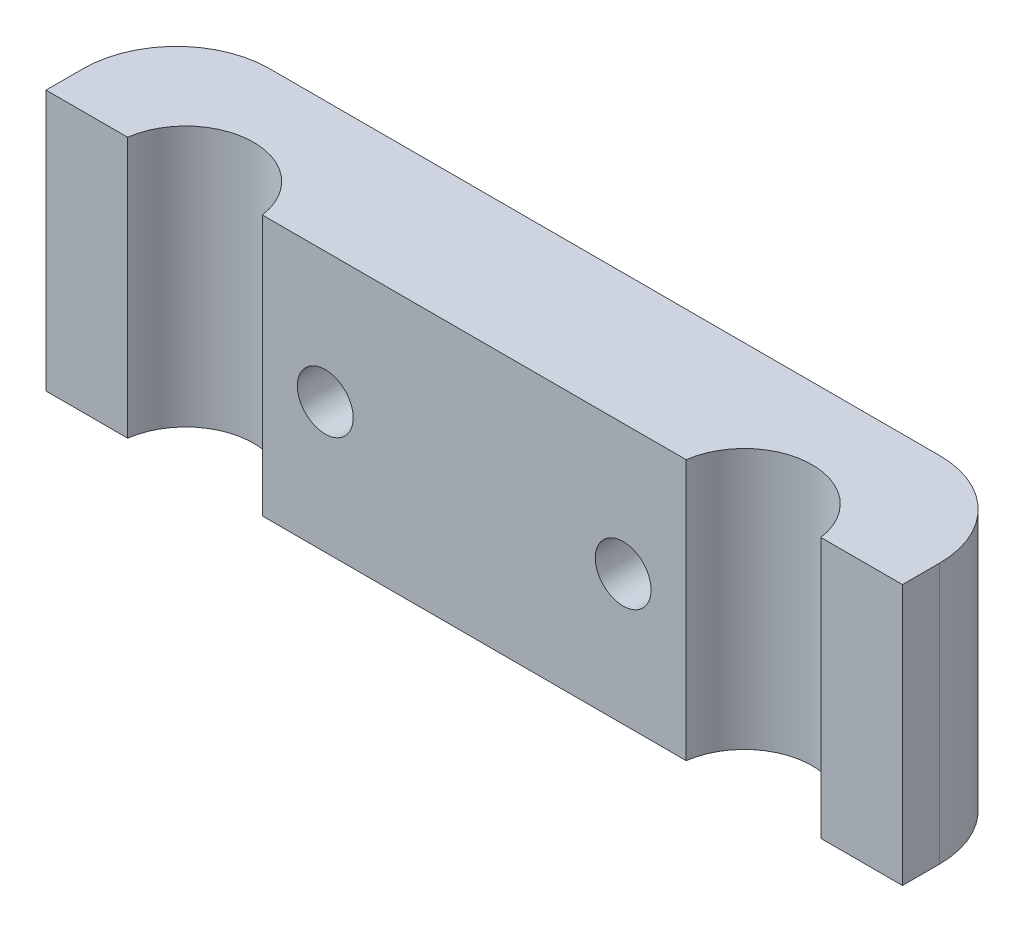
ISO-10303-21;
HEADER;
FILE_DESCRIPTION(('STEP AP214'),'2;1');
FILE_NAME('part.step','',(''),(''),'','','');
FILE_SCHEMA(('AUTOMOTIVE_DESIGN { 1 0 10303 214 1 1 1 1 }'));
ENDSEC;
DATA;
#1=APPLICATION_CONTEXT('core data for automotive mechanical design processes');
#2=APPLICATION_PROTOCOL_DEFINITION('international standard','automotive_design',2000,#1);
#3=PRODUCT_CONTEXT('',#1,'mechanical');
#4=PRODUCT('Part','Part','',(#3));
#5=PRODUCT_RELATED_PRODUCT_CATEGORY('part','',(#4));
#6=PRODUCT_DEFINITION_FORMATION('','',#4);
#7=PRODUCT_DEFINITION_CONTEXT('part definition',#1,'design');
#8=PRODUCT_DEFINITION('design','',#6,#7);
#9=PRODUCT_DEFINITION_SHAPE('','',#8);
#10=(LENGTH_UNIT() NAMED_UNIT(*) SI_UNIT(.MILLI.,.METRE.));
#11=(NAMED_UNIT(*) PLANE_ANGLE_UNIT() SI_UNIT($,.RADIAN.));
#12=(NAMED_UNIT(*) SI_UNIT($,.STERADIAN.) SOLID_ANGLE_UNIT());
#13=UNCERTAINTY_MEASURE_WITH_UNIT(LENGTH_MEASURE(1.E-05),#10,'distance_accuracy_value','');
#14=(GEOMETRIC_REPRESENTATION_CONTEXT(3) GLOBAL_UNCERTAINTY_ASSIGNED_CONTEXT((#13)) GLOBAL_UNIT_ASSIGNED_CONTEXT((#10,
#11,#12)) REPRESENTATION_CONTEXT('',''));
#15=CARTESIAN_POINT('',(0.,0.,0.));
#16=DIRECTION('',(0.,0.,1.));
#17=DIRECTION('',(1.,0.,0.));
#18=AXIS2_PLACEMENT_3D('',#15,#16,#17);
#19=CARTESIAN_POINT('',(8.,0.,-0.00100000000000013));
#20=DIRECTION('',(0.,0.,1.));
#21=DIRECTION('',(1.,0.,0.));
#22=AXIS2_PLACEMENT_3D('',#19,#20,#21);
#23=CYLINDRICAL_SURFACE('',#22,1.5);
#24=CARTESIAN_POINT('',(8.,0.,7.));
#25=DIRECTION('',(0.,0.,1.));
#26=DIRECTION('',(-1.,0.,0.));
#27=AXIS2_PLACEMENT_3D('',#24,#25,#26);
#28=CIRCLE('',#27,1.5);
#29=CARTESIAN_POINT('',(6.5,0.,7.));
#30=VERTEX_POINT('',#29);
#31=EDGE_CURVE('E220',#30,#30,#28,.T.);
#32=ORIENTED_EDGE('',*,*,#31,.T.);
#33=EDGE_LOOP('',(#32));
#34=FACE_BOUND('',#33,.T.);
#35=CARTESIAN_POINT('',(8.,0.,3.8));
#36=DIRECTION('',(0.,0.,-1.));
#37=DIRECTION('',(-1.,0.,0.));
#38=AXIS2_PLACEMENT_3D('',#35,#36,#37);
#39=CIRCLE('',#38,1.5);
#40=CARTESIAN_POINT('',(6.5,0.,3.8));
#41=VERTEX_POINT('',#40);
#42=EDGE_CURVE('E172',#41,#41,#39,.F.);
#43=ORIENTED_EDGE('',*,*,#42,.F.);
#44=EDGE_LOOP('',(#43));
#45=FACE_BOUND('',#44,.T.);
#46=ADVANCED_FACE('F33',(#34,#45),#23,.F.);
#47=CARTESIAN_POINT('',(-8.,0.,-0.00100000000000013));
#48=DIRECTION('',(0.,0.,1.));
#49=DIRECTION('',(1.,0.,0.));
#50=AXIS2_PLACEMENT_3D('',#47,#48,#49);
#51=CYLINDRICAL_SURFACE('',#50,1.5);
#52=CARTESIAN_POINT('',(-8.,0.,7.));
#53=DIRECTION('',(0.,0.,1.));
#54=DIRECTION('',(1.,0.,0.));
#55=AXIS2_PLACEMENT_3D('',#52,#53,#54);
#56=CIRCLE('',#55,1.5);
#57=CARTESIAN_POINT('',(-6.5,0.,7.));
#58=VERTEX_POINT('',#57);
#59=EDGE_CURVE('E156',#58,#58,#56,.T.);
#60=ORIENTED_EDGE('',*,*,#59,.T.);
#61=EDGE_LOOP('',(#60));
#62=FACE_BOUND('',#61,.T.);
#63=CARTESIAN_POINT('',(-8.,0.,3.8));
#64=DIRECTION('',(0.,0.,-1.));
#65=DIRECTION('',(-1.,0.,0.));
#66=AXIS2_PLACEMENT_3D('',#63,#64,#65);
#67=CIRCLE('',#66,1.5);
#68=CARTESIAN_POINT('',(-9.5,0.,3.8));
#69=VERTEX_POINT('',#68);
#70=EDGE_CURVE('E169',#69,#69,#67,.F.);
#71=ORIENTED_EDGE('',*,*,#70,.F.);
#72=EDGE_LOOP('',(#71));
#73=FACE_BOUND('',#72,.T.);
#74=ADVANCED_FACE('F236',(#62,#73),#51,.F.);
#75=CARTESIAN_POINT('',(0.,0.,7.));
#76=DIRECTION('',(0.,0.,-1.));
#77=DIRECTION('',(-1.,0.,0.));
#78=AXIS2_PLACEMENT_3D('',#75,#76,#77);
#79=PLANE('',#78);
#80=DIRECTION('',(1.,0.,0.));
#81=VECTOR('',#80,1.);
#82=CARTESIAN_POINT('',(-23.,-7.,7.));
#83=LINE('',#82,#81);
#84=CARTESIAN_POINT('',(-23.,-7.,7.));
#85=VERTEX_POINT('',#84);
#86=CARTESIAN_POINT('',(-18.6155912379582,-7.,7.));
#87=VERTEX_POINT('',#86);
#88=EDGE_CURVE('E130',#85,#87,#83,.T.);
#89=ORIENTED_EDGE('',*,*,#88,.T.);
#90=DIRECTION('',(0.,1.,0.));
#91=VECTOR('',#90,1.);
#92=CARTESIAN_POINT('',(-18.6155912379582,-7.001,7.));
#93=LINE('',#92,#91);
#94=CARTESIAN_POINT('',(-18.6155912379582,7.,7.));
#95=VERTEX_POINT('',#94);
#96=EDGE_CURVE('E114',#95,#87,#93,.F.);
#97=ORIENTED_EDGE('',*,*,#96,.F.);
#98=DIRECTION('',(-1.,0.,0.));
#99=VECTOR('',#98,1.);
#100=CARTESIAN_POINT('',(-23.,7.,7.));
#101=LINE('',#100,#99);
#102=CARTESIAN_POINT('',(-23.,7.,7.));
#103=VERTEX_POINT('',#102);
#104=EDGE_CURVE('E127',#95,#103,#101,.T.);
#105=ORIENTED_EDGE('',*,*,#104,.T.);
#106=DIRECTION('',(0.,-1.,0.));
#107=VECTOR('',#106,1.);
#108=CARTESIAN_POINT('',(-23.,-7.,7.));
#109=LINE('',#108,#107);
#110=EDGE_CURVE('E145',#103,#85,#109,.T.);
#111=ORIENTED_EDGE('',*,*,#110,.T.);
#112=EDGE_LOOP('',(#89,#97,#105,#111));
#113=FACE_BOUND('',#112,.T.);
#114=ADVANCED_FACE('F126',(#113),#79,.F.);
#115=ORIENTED_EDGE('',*,*,#31,.F.);
#116=EDGE_LOOP('',(#115));
#117=FACE_BOUND('',#116,.T.);
#118=ORIENTED_EDGE('',*,*,#59,.F.);
#119=EDGE_LOOP('',(#118));
#120=FACE_BOUND('',#119,.T.);
#121=CARTESIAN_POINT('',(11.3844087620418,7.,7.));
#122=VERTEX_POINT('',#121);
#123=CARTESIAN_POINT('',(-11.3844087620418,7.,7.));
#124=VERTEX_POINT('',#123);
#125=EDGE_CURVE('E136',#122,#124,#101,.T.);
#126=ORIENTED_EDGE('',*,*,#125,.T.);
#127=DIRECTION('',(0.,1.,0.));
#128=VECTOR('',#127,1.);
#129=CARTESIAN_POINT('',(-11.3844087620418,-7.001,7.));
#130=LINE('',#129,#128);
#131=CARTESIAN_POINT('',(-11.3844087620418,-7.,7.));
#132=VERTEX_POINT('',#131);
#133=EDGE_CURVE('E117',#132,#124,#130,.T.);
#134=ORIENTED_EDGE('',*,*,#133,.F.);
#135=CARTESIAN_POINT('',(11.3844087620418,-7.,7.));
#136=VERTEX_POINT('',#135);
#137=EDGE_CURVE('E150',#132,#136,#83,.T.);
#138=ORIENTED_EDGE('',*,*,#137,.T.);
#139=DIRECTION('',(0.,1.,0.));
#140=VECTOR('',#139,1.);
#141=CARTESIAN_POINT('',(11.3844087620418,-7.001,7.));
#142=LINE('',#141,#140);
#143=EDGE_CURVE('E213',#122,#136,#142,.F.);
#144=ORIENTED_EDGE('',*,*,#143,.F.);
#145=EDGE_LOOP('',(#126,#134,#138,#144));
#146=FACE_BOUND('',#145,.T.);
#147=ADVANCED_FACE('F212',(#117,#120,#146),#79,.F.);
#148=CARTESIAN_POINT('',(23.,-7.,7.));
#149=DIRECTION('',(-1.,0.,0.));
#150=DIRECTION('',(0.,0.,1.));
#151=AXIS2_PLACEMENT_3D('',#148,#149,#150);
#152=PLANE('',#151);
#153=DIRECTION('',(0.,0.,-1.));
#154=VECTOR('',#153,1.);
#155=CARTESIAN_POINT('',(23.,-7.,7.));
#156=LINE('',#155,#154);
#157=CARTESIAN_POINT('',(23.,-7.,7.));
#158=VERTEX_POINT('',#157);
#159=CARTESIAN_POINT('',(23.,-7.,5.));
#160=VERTEX_POINT('',#159);
#161=EDGE_CURVE('E153',#158,#160,#156,.T.);
#162=ORIENTED_EDGE('',*,*,#161,.T.);
#163=DIRECTION('',(0.,1.,0.));
#164=VECTOR('',#163,1.);
#165=CARTESIAN_POINT('',(23.,7.,5.));
#166=LINE('',#165,#164);
#167=CARTESIAN_POINT('',(23.,7.,5.));
#168=VERTEX_POINT('',#167);
#169=EDGE_CURVE('E11',#160,#168,#166,.T.);
#170=ORIENTED_EDGE('',*,*,#169,.T.);
#171=DIRECTION('',(0.,0.,-1.));
#172=VECTOR('',#171,1.);
#173=CARTESIAN_POINT('',(23.,7.,7.));
#174=LINE('',#173,#172);
#175=CARTESIAN_POINT('',(23.,7.,7.));
#176=VERTEX_POINT('',#175);
#177=EDGE_CURVE('E165',#176,#168,#174,.T.);
#178=ORIENTED_EDGE('',*,*,#177,.F.);
#179=DIRECTION('',(0.,1.,0.));
#180=VECTOR('',#179,1.);
#181=CARTESIAN_POINT('',(23.,-7.,7.));
#182=LINE('',#181,#180);
#183=EDGE_CURVE('E137',#158,#176,#182,.T.);
#184=ORIENTED_EDGE('',*,*,#183,.F.);
#185=EDGE_LOOP('',(#162,#170,#178,#184));
#186=FACE_BOUND('',#185,.T.);
#187=ADVANCED_FACE('F200',(#186),#152,.F.);
#188=CARTESIAN_POINT('',(-23.,7.,7.));
#189=DIRECTION('',(0.,-1.,0.));
#190=DIRECTION('',(0.,0.,-1.));
#191=AXIS2_PLACEMENT_3D('',#188,#189,#190);
#192=PLANE('',#191);
#193=DIRECTION('',(-1.,0.,0.));
#194=VECTOR('',#193,1.);
#195=CARTESIAN_POINT('',(-23.,7.,0.));
#196=LINE('',#195,#194);
#197=CARTESIAN_POINT('',(18.,7.,0.));
#198=VERTEX_POINT('',#197);
#199=CARTESIAN_POINT('',(-18.,7.,0.));
#200=VERTEX_POINT('',#199);
#201=EDGE_CURVE('E154',#198,#200,#196,.T.);
#202=ORIENTED_EDGE('',*,*,#201,.T.);
#203=CARTESIAN_POINT('',(-18.,7.,5.));
#204=DIRECTION('',(0.,-1.,0.));
#205=DIRECTION('',(0.,0.,-1.));
#206=AXIS2_PLACEMENT_3D('',#203,#204,#205);
#207=CIRCLE('',#206,5.);
#208=CARTESIAN_POINT('',(-23.,7.,5.));
#209=VERTEX_POINT('',#208);
#210=EDGE_CURVE('E41',#200,#209,#207,.F.);
#211=ORIENTED_EDGE('',*,*,#210,.T.);
#212=DIRECTION('',(0.,0.,-1.));
#213=VECTOR('',#212,1.);
#214=CARTESIAN_POINT('',(-23.,7.,7.));
#215=LINE('',#214,#213);
#216=EDGE_CURVE('E134',#103,#209,#215,.T.);
#217=ORIENTED_EDGE('',*,*,#216,.F.);
#218=ORIENTED_EDGE('',*,*,#104,.F.);
#219=CARTESIAN_POINT('',(-15.,7.,7.5));
#220=DIRECTION('',(0.,1.,0.));
#221=DIRECTION('',(0.,0.,1.));
#222=AXIS2_PLACEMENT_3D('',#219,#220,#221);
#223=CIRCLE('',#222,3.65);
#224=EDGE_CURVE('E111',#124,#95,#223,.T.);
#225=ORIENTED_EDGE('',*,*,#224,.F.);
#226=ORIENTED_EDGE('',*,*,#125,.F.);
#227=CARTESIAN_POINT('',(15.,7.,7.5));
#228=DIRECTION('',(0.,1.,0.));
#229=DIRECTION('',(0.,0.,-1.));
#230=AXIS2_PLACEMENT_3D('',#227,#228,#229);
#231=CIRCLE('',#230,3.65);
#232=CARTESIAN_POINT('',(18.6155912379582,7.,7.));
#233=VERTEX_POINT('',#232);
#234=EDGE_CURVE('E208',#233,#122,#231,.T.);
#235=ORIENTED_EDGE('',*,*,#234,.F.);
#236=EDGE_CURVE('E139',#176,#233,#101,.T.);
#237=ORIENTED_EDGE('',*,*,#236,.F.);
#238=ORIENTED_EDGE('',*,*,#177,.T.);
#239=CARTESIAN_POINT('',(18.,7.,5.));
#240=DIRECTION('',(0.,-1.,0.));
#241=DIRECTION('',(0.,0.,-1.));
#242=AXIS2_PLACEMENT_3D('',#239,#240,#241);
#243=CIRCLE('',#242,5.);
#244=EDGE_CURVE('E48',#168,#198,#243,.F.);
#245=ORIENTED_EDGE('',*,*,#244,.T.);
#246=EDGE_LOOP('',(#202,#211,#217,#218,#225,#226,#235,#237,#238,#245));
#247=FACE_BOUND('',#246,.T.);
#248=ADVANCED_FACE('F132',(#247),#192,.F.);
#249=CARTESIAN_POINT('',(-23.,-7.,7.));
#250=DIRECTION('',(1.,0.,0.));
#251=DIRECTION('',(0.,0.,-1.));
#252=AXIS2_PLACEMENT_3D('',#249,#250,#251);
#253=PLANE('',#252);
#254=ORIENTED_EDGE('',*,*,#216,.T.);
#255=DIRECTION('',(0.,-1.,0.));
#256=VECTOR('',#255,1.);
#257=CARTESIAN_POINT('',(-23.,-7.,5.));
#258=LINE('',#257,#256);
#259=CARTESIAN_POINT('',(-23.,-7.,5.));
#260=VERTEX_POINT('',#259);
#261=EDGE_CURVE('E168',#209,#260,#258,.T.);
#262=ORIENTED_EDGE('',*,*,#261,.T.);
#263=DIRECTION('',(0.,0.,-1.));
#264=VECTOR('',#263,1.);
#265=CARTESIAN_POINT('',(-23.,-7.,7.));
#266=LINE('',#265,#264);
#267=EDGE_CURVE('E161',#85,#260,#266,.T.);
#268=ORIENTED_EDGE('',*,*,#267,.F.);
#269=ORIENTED_EDGE('',*,*,#110,.F.);
#270=EDGE_LOOP('',(#254,#262,#268,#269));
#271=FACE_BOUND('',#270,.T.);
#272=ADVANCED_FACE('F190',(#271),#253,.F.);
#273=CARTESIAN_POINT('',(-23.,-7.,7.));
#274=DIRECTION('',(0.,1.,0.));
#275=DIRECTION('',(0.,0.,1.));
#276=AXIS2_PLACEMENT_3D('',#273,#274,#275);
#277=PLANE('',#276);
#278=ORIENTED_EDGE('',*,*,#267,.T.);
#279=CARTESIAN_POINT('',(-18.,-7.,5.));
#280=DIRECTION('',(0.,1.,0.));
#281=DIRECTION('',(0.,0.,1.));
#282=AXIS2_PLACEMENT_3D('',#279,#280,#281);
#283=CIRCLE('',#282,5.);
#284=CARTESIAN_POINT('',(-18.,-7.,0.));
#285=VERTEX_POINT('',#284);
#286=EDGE_CURVE('E181',#260,#285,#283,.F.);
#287=ORIENTED_EDGE('',*,*,#286,.T.);
#288=DIRECTION('',(1.,0.,0.));
#289=VECTOR('',#288,1.);
#290=CARTESIAN_POINT('',(-23.,-7.,0.));
#291=LINE('',#290,#289);
#292=CARTESIAN_POINT('',(18.,-7.,0.));
#293=VERTEX_POINT('',#292);
#294=EDGE_CURVE('E141',#285,#293,#291,.T.);
#295=ORIENTED_EDGE('',*,*,#294,.T.);
#296=CARTESIAN_POINT('',(18.,-7.,5.));
#297=DIRECTION('',(0.,1.,0.));
#298=DIRECTION('',(0.,0.,1.));
#299=AXIS2_PLACEMENT_3D('',#296,#297,#298);
#300=CIRCLE('',#299,5.);
#301=EDGE_CURVE('E179',#293,#160,#300,.F.);
#302=ORIENTED_EDGE('',*,*,#301,.T.);
#303=ORIENTED_EDGE('',*,*,#161,.F.);
#304=CARTESIAN_POINT('',(18.6155912379582,-7.,7.));
#305=VERTEX_POINT('',#304);
#306=EDGE_CURVE('E148',#305,#158,#83,.T.);
#307=ORIENTED_EDGE('',*,*,#306,.F.);
#308=CARTESIAN_POINT('',(15.,-7.,7.5));
#309=DIRECTION('',(0.,1.,0.));
#310=DIRECTION('',(0.,0.,1.));
#311=AXIS2_PLACEMENT_3D('',#308,#309,#310);
#312=CIRCLE('',#311,3.65);
#313=EDGE_CURVE('E205',#136,#305,#312,.F.);
#314=ORIENTED_EDGE('',*,*,#313,.F.);
#315=ORIENTED_EDGE('',*,*,#137,.F.);
#316=CARTESIAN_POINT('',(-15.,-7.,7.5));
#317=DIRECTION('',(0.,1.,0.));
#318=DIRECTION('',(0.,0.,1.));
#319=AXIS2_PLACEMENT_3D('',#316,#317,#318);
#320=CIRCLE('',#319,3.65);
#321=EDGE_CURVE('E122',#87,#132,#320,.F.);
#322=ORIENTED_EDGE('',*,*,#321,.F.);
#323=ORIENTED_EDGE('',*,*,#88,.F.);
#324=EDGE_LOOP('',(#278,#287,#295,#302,#303,#307,#314,#315,#322,#323));
#325=FACE_BOUND('',#324,.T.);
#326=ADVANCED_FACE('F193',(#325),#277,.F.);
#327=ORIENTED_EDGE('',*,*,#236,.T.);
#328=DIRECTION('',(0.,1.,0.));
#329=VECTOR('',#328,1.);
#330=CARTESIAN_POINT('',(18.6155912379582,-7.001,7.));
#331=LINE('',#330,#329);
#332=EDGE_CURVE('E176',#305,#233,#331,.T.);
#333=ORIENTED_EDGE('',*,*,#332,.F.);
#334=ORIENTED_EDGE('',*,*,#306,.T.);
#335=ORIENTED_EDGE('',*,*,#183,.T.);
#336=EDGE_LOOP('',(#327,#333,#334,#335));
#337=FACE_BOUND('',#336,.T.);
#338=ADVANCED_FACE('F202',(#337),#79,.F.);
#339=CARTESIAN_POINT('',(0.,0.,0.));
#340=DIRECTION('',(0.,0.,-1.));
#341=DIRECTION('',(-1.,0.,0.));
#342=AXIS2_PLACEMENT_3D('',#339,#340,#341);
#343=PLANE('',#342);
#344=CARTESIAN_POINT('',(8.,0.,0.));
#345=DIRECTION('',(0.,0.,-1.));
#346=DIRECTION('',(-1.,0.,0.));
#347=AXIS2_PLACEMENT_3D('',#344,#345,#346);
#348=CIRCLE('',#347,3.);
#349=CARTESIAN_POINT('',(5.,0.,0.));
#350=VERTEX_POINT('',#349);
#351=EDGE_CURVE('E292',#350,#350,#348,.T.);
#352=ORIENTED_EDGE('',*,*,#351,.F.);
#353=EDGE_LOOP('',(#352));
#354=FACE_BOUND('',#353,.T.);
#355=CARTESIAN_POINT('',(-8.,0.,0.));
#356=DIRECTION('',(0.,0.,-1.));
#357=DIRECTION('',(-1.,0.,0.));
#358=AXIS2_PLACEMENT_3D('',#355,#356,#357);
#359=CIRCLE('',#358,3.);
#360=CARTESIAN_POINT('',(-11.,0.,0.));
#361=VERTEX_POINT('',#360);
#362=EDGE_CURVE('E216',#361,#361,#359,.T.);
#363=ORIENTED_EDGE('',*,*,#362,.F.);
#364=EDGE_LOOP('',(#363));
#365=FACE_BOUND('',#364,.T.);
#366=ORIENTED_EDGE('',*,*,#294,.F.);
#367=DIRECTION('',(0.,-1.,0.));
#368=VECTOR('',#367,1.);
#369=CARTESIAN_POINT('',(-18.,7.,0.));
#370=LINE('',#369,#368);
#371=EDGE_CURVE('E55',#285,#200,#370,.F.);
#372=ORIENTED_EDGE('',*,*,#371,.T.);
#373=ORIENTED_EDGE('',*,*,#201,.F.);
#374=DIRECTION('',(0.,1.,0.));
#375=VECTOR('',#374,1.);
#376=CARTESIAN_POINT('',(18.,-7.,0.));
#377=LINE('',#376,#375);
#378=EDGE_CURVE('E183',#198,#293,#377,.F.);
#379=ORIENTED_EDGE('',*,*,#378,.T.);
#380=EDGE_LOOP('',(#366,#372,#373,#379));
#381=FACE_BOUND('',#380,.T.);
#382=ADVANCED_FACE('F195',(#354,#365,#381),#343,.T.);
#383=CARTESIAN_POINT('',(15.,-7.001,7.5));
#384=DIRECTION('',(0.,1.,0.));
#385=DIRECTION('',(0.,0.,1.));
#386=AXIS2_PLACEMENT_3D('',#383,#384,#385);
#387=CYLINDRICAL_SURFACE('',#386,3.65);
#388=ORIENTED_EDGE('',*,*,#143,.T.);
#389=ORIENTED_EDGE('',*,*,#313,.T.);
#390=ORIENTED_EDGE('',*,*,#332,.T.);
#391=ORIENTED_EDGE('',*,*,#234,.T.);
#392=EDGE_LOOP('',(#388,#389,#390,#391));
#393=FACE_BOUND('',#392,.T.);
#394=ADVANCED_FACE('F254',(#393),#387,.F.);
#395=CARTESIAN_POINT('',(-15.,-7.001,7.5));
#396=DIRECTION('',(0.,1.,0.));
#397=DIRECTION('',(0.,0.,1.));
#398=AXIS2_PLACEMENT_3D('',#395,#396,#397);
#399=CYLINDRICAL_SURFACE('',#398,3.65);
#400=ORIENTED_EDGE('',*,*,#96,.T.);
#401=ORIENTED_EDGE('',*,*,#321,.T.);
#402=ORIENTED_EDGE('',*,*,#133,.T.);
#403=ORIENTED_EDGE('',*,*,#224,.T.);
#404=EDGE_LOOP('',(#400,#401,#402,#403));
#405=FACE_BOUND('',#404,.T.);
#406=ADVANCED_FACE('F113',(#405),#399,.F.);
#407=CARTESIAN_POINT('',(-8.,0.,3.8));
#408=DIRECTION('',(0.,0.,-1.));
#409=DIRECTION('',(-1.,0.,0.));
#410=AXIS2_PLACEMENT_3D('',#407,#408,#409);
#411=PLANE('',#410);
#412=CARTESIAN_POINT('',(-8.,0.,3.8));
#413=DIRECTION('',(0.,0.,-1.));
#414=DIRECTION('',(-1.,0.,0.));
#415=AXIS2_PLACEMENT_3D('',#412,#413,#414);
#416=CIRCLE('',#415,3.);
#417=CARTESIAN_POINT('',(-11.,0.,3.8));
#418=VERTEX_POINT('',#417);
#419=EDGE_CURVE('E293',#418,#418,#416,.T.);
#420=ORIENTED_EDGE('',*,*,#419,.T.);
#421=EDGE_LOOP('',(#420));
#422=FACE_BOUND('',#421,.T.);
#423=ORIENTED_EDGE('',*,*,#70,.T.);
#424=EDGE_LOOP('',(#423));
#425=FACE_BOUND('',#424,.T.);
#426=ADVANCED_FACE('F242',(#422,#425),#411,.T.);
#427=CARTESIAN_POINT('',(-8.,0.,3.8));
#428=DIRECTION('',(0.,0.,-1.));
#429=DIRECTION('',(-1.,0.,0.));
#430=AXIS2_PLACEMENT_3D('',#427,#428,#429);
#431=CYLINDRICAL_SURFACE('',#430,3.);
#432=CARTESIAN_POINT('',(-11.,0.,3.8));
#433=CARTESIAN_POINT('',(-11.,0.,3.76041666666667));
#434=CARTESIAN_POINT('',(-11.,0.,3.72083333333333));
#435=CARTESIAN_POINT('',(-11.,0.,3.64166666666667));
#436=CARTESIAN_POINT('',(-11.,0.,3.60208333333333));
#437=CARTESIAN_POINT('',(-11.,0.,3.52291666666667));
#438=CARTESIAN_POINT('',(-11.,0.,3.48333333333333));
#439=CARTESIAN_POINT('',(-11.,0.,3.40416666666667));
#440=CARTESIAN_POINT('',(-11.,0.,3.36458333333333));
#441=CARTESIAN_POINT('',(-11.,0.,3.28541666666667));
#442=CARTESIAN_POINT('',(-11.,0.,3.24583333333333));
#443=CARTESIAN_POINT('',(-11.,0.,3.16666666666667));
#444=CARTESIAN_POINT('',(-11.,0.,3.12708333333333));
#445=CARTESIAN_POINT('',(-11.,0.,3.04791666666667));
#446=CARTESIAN_POINT('',(-11.,0.,3.00833333333333));
#447=CARTESIAN_POINT('',(-11.,0.,2.92916666666667));
#448=CARTESIAN_POINT('',(-11.,0.,2.88958333333333));
#449=CARTESIAN_POINT('',(-11.,0.,2.81041666666667));
#450=CARTESIAN_POINT('',(-11.,0.,2.77083333333333));
#451=CARTESIAN_POINT('',(-11.,0.,2.69166666666667));
#452=CARTESIAN_POINT('',(-11.,0.,2.65208333333333));
#453=CARTESIAN_POINT('',(-11.,0.,2.57291666666667));
#454=CARTESIAN_POINT('',(-11.,0.,2.53333333333333));
#455=CARTESIAN_POINT('',(-11.,0.,2.45416666666667));
#456=CARTESIAN_POINT('',(-11.,0.,2.41458333333333));
#457=CARTESIAN_POINT('',(-11.,0.,2.33541666666667));
#458=CARTESIAN_POINT('',(-11.,0.,2.29583333333333));
#459=CARTESIAN_POINT('',(-11.,0.,2.21666666666667));
#460=CARTESIAN_POINT('',(-11.,0.,2.17708333333333));
#461=CARTESIAN_POINT('',(-11.,0.,2.09791666666667));
#462=CARTESIAN_POINT('',(-11.,0.,2.05833333333333));
#463=CARTESIAN_POINT('',(-11.,0.,1.97916666666667));
#464=CARTESIAN_POINT('',(-11.,0.,1.93958333333333));
#465=CARTESIAN_POINT('',(-11.,0.,1.86041666666667));
#466=CARTESIAN_POINT('',(-11.,0.,1.82083333333333));
#467=CARTESIAN_POINT('',(-11.,0.,1.74166666666667));
#468=CARTESIAN_POINT('',(-11.,0.,1.70208333333333));
#469=CARTESIAN_POINT('',(-11.,0.,1.62291666666667));
#470=CARTESIAN_POINT('',(-11.,0.,1.58333333333333));
#471=CARTESIAN_POINT('',(-11.,0.,1.50416666666667));
#472=CARTESIAN_POINT('',(-11.,0.,1.46458333333333));
#473=CARTESIAN_POINT('',(-11.,0.,1.38541666666667));
#474=CARTESIAN_POINT('',(-11.,0.,1.34583333333333));
#475=CARTESIAN_POINT('',(-11.,0.,1.26666666666667));
#476=CARTESIAN_POINT('',(-11.,0.,1.22708333333333));
#477=CARTESIAN_POINT('',(-11.,0.,1.14791666666667));
#478=CARTESIAN_POINT('',(-11.,0.,1.10833333333333));
#479=CARTESIAN_POINT('',(-11.,0.,1.02916666666667));
#480=CARTESIAN_POINT('',(-11.,0.,0.989583333333334));
#481=CARTESIAN_POINT('',(-11.,0.,0.910416666666667));
#482=CARTESIAN_POINT('',(-11.,0.,0.870833333333334));
#483=CARTESIAN_POINT('',(-11.,0.,0.791666666666667));
#484=CARTESIAN_POINT('',(-11.,0.,0.752083333333333));
#485=CARTESIAN_POINT('',(-11.,0.,0.672916666666667));
#486=CARTESIAN_POINT('',(-11.,0.,0.633333333333333));
#487=CARTESIAN_POINT('',(-11.,0.,0.554166666666667));
#488=CARTESIAN_POINT('',(-11.,0.,0.514583333333334));
#489=CARTESIAN_POINT('',(-11.,0.,0.435416666666667));
#490=CARTESIAN_POINT('',(-11.,0.,0.395833333333334));
#491=CARTESIAN_POINT('',(-11.,0.,0.316666666666667));
#492=CARTESIAN_POINT('',(-11.,0.,0.277083333333333));
#493=CARTESIAN_POINT('',(-11.,0.,0.197916666666667));
#494=CARTESIAN_POINT('',(-11.,0.,0.158333333333333));
#495=CARTESIAN_POINT('',(-11.,0.,0.0791666666666666));
#496=CARTESIAN_POINT('',(-11.,0.,0.0395833333333333));
#497=CARTESIAN_POINT('',(-11.,0.,0.));
#498=B_SPLINE_CURVE_WITH_KNOTS('',3,(#432,#433,#434,#435,#436,#437,#438,#439,#440,#441,#442,
#443,#444,#445,#446,#447,#448,#449,#450,#451,#452,#453,#454,#455,#456,#457,#458,#459,#460,#461,
#462,#463,#464,#465,#466,#467,#468,#469,#470,#471,#472,#473,#474,#475,#476,#477,#478,#479,#480,
#481,#482,#483,#484,#485,#486,#487,#488,#489,#490,#491,#492,#493,#494,#495,#496,#497),
.UNSPECIFIED.,.F.,.F.,(4,2,2,2,2,2,2,2,2,2,2,2,2,2,2,2,2,2,2,2,2,2,2,2,2,2,2,2,2,2,2,2,4),(0.,
0.11875,0.2375,0.35625,0.475,0.59375,0.7125,0.83125,0.95,1.06875,1.1875,1.30625,1.425,1.54375,
1.6625,1.78125,1.9,2.01875,2.1375,2.25625,2.375,2.49375,2.6125,2.73125,2.85,2.96875,3.0875,
3.20625,3.325,3.44375,3.5625,3.68125,3.8),.UNSPECIFIED.);
#499=EDGE_CURVE('BSEAM244',#418,#361,#498,.T.);
#500=ORIENTED_EDGE('',*,*,#419,.F.);
#501=ORIENTED_EDGE('',*,*,#362,.T.);
#502=ORIENTED_EDGE('',*,*,#499,.T.);
#503=ORIENTED_EDGE('',*,*,#499,.F.);
#504=EDGE_LOOP('',(#500,#502,#501,#503));
#505=FACE_BOUND('',#504,.T.);
#506=ADVANCED_FACE('F244',(#505),#431,.F.);
#507=CARTESIAN_POINT('',(8.,0.,3.8));
#508=DIRECTION('',(0.,0.,-1.));
#509=DIRECTION('',(-1.,0.,0.));
#510=AXIS2_PLACEMENT_3D('',#507,#508,#509);
#511=PLANE('',#510);
#512=CARTESIAN_POINT('',(8.,0.,3.8));
#513=DIRECTION('',(0.,0.,-1.));
#514=DIRECTION('',(-1.,0.,0.));
#515=AXIS2_PLACEMENT_3D('',#512,#513,#514);
#516=CIRCLE('',#515,3.);
#517=CARTESIAN_POINT('',(5.,0.,3.8));
#518=VERTEX_POINT('',#517);
#519=EDGE_CURVE('E173',#518,#518,#516,.T.);
#520=ORIENTED_EDGE('',*,*,#519,.T.);
#521=EDGE_LOOP('',(#520));
#522=FACE_BOUND('',#521,.T.);
#523=ORIENTED_EDGE('',*,*,#42,.T.);
#524=EDGE_LOOP('',(#523));
#525=FACE_BOUND('',#524,.T.);
#526=ADVANCED_FACE('F251',(#522,#525),#511,.T.);
#527=CARTESIAN_POINT('',(8.,0.,3.8));
#528=DIRECTION('',(0.,0.,-1.));
#529=DIRECTION('',(-1.,0.,0.));
#530=AXIS2_PLACEMENT_3D('',#527,#528,#529);
#531=CYLINDRICAL_SURFACE('',#530,3.);
#532=CARTESIAN_POINT('',(5.,0.,3.8));
#533=CARTESIAN_POINT('',(5.,0.,3.76041666666667));
#534=CARTESIAN_POINT('',(5.,0.,3.72083333333333));
#535=CARTESIAN_POINT('',(5.,0.,3.64166666666667));
#536=CARTESIAN_POINT('',(5.,0.,3.60208333333333));
#537=CARTESIAN_POINT('',(5.,0.,3.52291666666667));
#538=CARTESIAN_POINT('',(5.,0.,3.48333333333333));
#539=CARTESIAN_POINT('',(5.,0.,3.40416666666667));
#540=CARTESIAN_POINT('',(5.,0.,3.36458333333333));
#541=CARTESIAN_POINT('',(5.,0.,3.28541666666667));
#542=CARTESIAN_POINT('',(5.,0.,3.24583333333333));
#543=CARTESIAN_POINT('',(5.,0.,3.16666666666667));
#544=CARTESIAN_POINT('',(5.,0.,3.12708333333333));
#545=CARTESIAN_POINT('',(5.,0.,3.04791666666667));
#546=CARTESIAN_POINT('',(5.,0.,3.00833333333333));
#547=CARTESIAN_POINT('',(5.,0.,2.92916666666667));
#548=CARTESIAN_POINT('',(5.,0.,2.88958333333333));
#549=CARTESIAN_POINT('',(5.,0.,2.81041666666667));
#550=CARTESIAN_POINT('',(5.,0.,2.77083333333333));
#551=CARTESIAN_POINT('',(5.,0.,2.69166666666667));
#552=CARTESIAN_POINT('',(5.,0.,2.65208333333333));
#553=CARTESIAN_POINT('',(5.,0.,2.57291666666667));
#554=CARTESIAN_POINT('',(5.,0.,2.53333333333333));
#555=CARTESIAN_POINT('',(5.,0.,2.45416666666667));
#556=CARTESIAN_POINT('',(5.,0.,2.41458333333333));
#557=CARTESIAN_POINT('',(5.,0.,2.33541666666667));
#558=CARTESIAN_POINT('',(5.,0.,2.29583333333333));
#559=CARTESIAN_POINT('',(5.,0.,2.21666666666667));
#560=CARTESIAN_POINT('',(5.,0.,2.17708333333333));
#561=CARTESIAN_POINT('',(5.,0.,2.09791666666667));
#562=CARTESIAN_POINT('',(5.,0.,2.05833333333333));
#563=CARTESIAN_POINT('',(5.,0.,1.97916666666667));
#564=CARTESIAN_POINT('',(5.,0.,1.93958333333333));
#565=CARTESIAN_POINT('',(5.,0.,1.86041666666667));
#566=CARTESIAN_POINT('',(5.,0.,1.82083333333333));
#567=CARTESIAN_POINT('',(5.,0.,1.74166666666667));
#568=CARTESIAN_POINT('',(5.,0.,1.70208333333333));
#569=CARTESIAN_POINT('',(5.,0.,1.62291666666667));
#570=CARTESIAN_POINT('',(5.,0.,1.58333333333333));
#571=CARTESIAN_POINT('',(5.,0.,1.50416666666667));
#572=CARTESIAN_POINT('',(5.,0.,1.46458333333333));
#573=CARTESIAN_POINT('',(5.,0.,1.38541666666667));
#574=CARTESIAN_POINT('',(5.,0.,1.34583333333333));
#575=CARTESIAN_POINT('',(5.,0.,1.26666666666667));
#576=CARTESIAN_POINT('',(5.,0.,1.22708333333333));
#577=CARTESIAN_POINT('',(5.,0.,1.14791666666667));
#578=CARTESIAN_POINT('',(5.,0.,1.10833333333333));
#579=CARTESIAN_POINT('',(5.,0.,1.02916666666667));
#580=CARTESIAN_POINT('',(5.,0.,0.989583333333334));
#581=CARTESIAN_POINT('',(5.,0.,0.910416666666667));
#582=CARTESIAN_POINT('',(5.,0.,0.870833333333334));
#583=CARTESIAN_POINT('',(5.,0.,0.791666666666667));
#584=CARTESIAN_POINT('',(5.,0.,0.752083333333333));
#585=CARTESIAN_POINT('',(5.,0.,0.672916666666667));
#586=CARTESIAN_POINT('',(5.,0.,0.633333333333333));
#587=CARTESIAN_POINT('',(5.,0.,0.554166666666667));
#588=CARTESIAN_POINT('',(5.,0.,0.514583333333334));
#589=CARTESIAN_POINT('',(5.,0.,0.435416666666667));
#590=CARTESIAN_POINT('',(5.,0.,0.395833333333334));
#591=CARTESIAN_POINT('',(5.,0.,0.316666666666667));
#592=CARTESIAN_POINT('',(5.,0.,0.277083333333333));
#593=CARTESIAN_POINT('',(5.,0.,0.197916666666667));
#594=CARTESIAN_POINT('',(5.,0.,0.158333333333333));
#595=CARTESIAN_POINT('',(5.,0.,0.0791666666666666));
#596=CARTESIAN_POINT('',(5.,0.,0.0395833333333333));
#597=CARTESIAN_POINT('',(5.,0.,0.));
#598=B_SPLINE_CURVE_WITH_KNOTS('',3,(#532,#533,#534,#535,#536,#537,#538,#539,#540,#541,#542,
#543,#544,#545,#546,#547,#548,#549,#550,#551,#552,#553,#554,#555,#556,#557,#558,#559,#560,#561,
#562,#563,#564,#565,#566,#567,#568,#569,#570,#571,#572,#573,#574,#575,#576,#577,#578,#579,#580,
#581,#582,#583,#584,#585,#586,#587,#588,#589,#590,#591,#592,#593,#594,#595,#596,#597),
.UNSPECIFIED.,.F.,.F.,(4,2,2,2,2,2,2,2,2,2,2,2,2,2,2,2,2,2,2,2,2,2,2,2,2,2,2,2,2,2,2,2,4),(0.,
0.11875,0.2375,0.35625,0.475,0.59375,0.7125,0.83125,0.95,1.06875,1.1875,1.30625,1.425,1.54375,
1.6625,1.78125,1.9,2.01875,2.1375,2.25625,2.375,2.49375,2.6125,2.73125,2.85,2.96875,3.0875,
3.20625,3.325,3.44375,3.5625,3.68125,3.8),.UNSPECIFIED.);
#599=EDGE_CURVE('BSEAM276',#518,#350,#598,.T.);
#600=ORIENTED_EDGE('',*,*,#519,.F.);
#601=ORIENTED_EDGE('',*,*,#351,.T.);
#602=ORIENTED_EDGE('',*,*,#599,.T.);
#603=ORIENTED_EDGE('',*,*,#599,.F.);
#604=EDGE_LOOP('',(#600,#602,#601,#603));
#605=FACE_BOUND('',#604,.T.);
#606=ADVANCED_FACE('F276',(#605),#531,.F.);
#607=CARTESIAN_POINT('',(-18.,-7.,5.));
#608=DIRECTION('',(0.,1.,0.));
#609=DIRECTION('',(0.,0.,1.));
#610=AXIS2_PLACEMENT_3D('',#607,#608,#609);
#611=CYLINDRICAL_SURFACE('',#610,5.);
#612=ORIENTED_EDGE('',*,*,#210,.F.);
#613=ORIENTED_EDGE('',*,*,#371,.F.);
#614=ORIENTED_EDGE('',*,*,#286,.F.);
#615=ORIENTED_EDGE('',*,*,#261,.F.);
#616=EDGE_LOOP('',(#612,#613,#614,#615));
#617=FACE_BOUND('',#616,.T.);
#618=ADVANCED_FACE('F191',(#617),#611,.T.);
#619=CARTESIAN_POINT('',(18.,-7.,5.));
#620=DIRECTION('',(0.,-1.,0.));
#621=DIRECTION('',(0.,0.,-1.));
#622=AXIS2_PLACEMENT_3D('',#619,#620,#621);
#623=CYLINDRICAL_SURFACE('',#622,5.);
#624=ORIENTED_EDGE('',*,*,#301,.F.);
#625=ORIENTED_EDGE('',*,*,#378,.F.);
#626=ORIENTED_EDGE('',*,*,#244,.F.);
#627=ORIENTED_EDGE('',*,*,#169,.F.);
#628=EDGE_LOOP('',(#624,#625,#626,#627));
#629=FACE_BOUND('',#628,.T.);
#630=ADVANCED_FACE('F35',(#629),#623,.T.);
#631=CLOSED_SHELL('',(#46,#74,#114,#147,#187,#248,#272,#326,#338,#382,#394,#406,#426,#506,#526,
#606,#618,#630));
#632=MANIFOLD_SOLID_BREP('B2',#631);
#633=ADVANCED_BREP_SHAPE_REPRESENTATION('',(#18,#632),#14);
#634=SHAPE_DEFINITION_REPRESENTATION(#9,#633);
ENDSEC;
END-ISO-10303-21;
